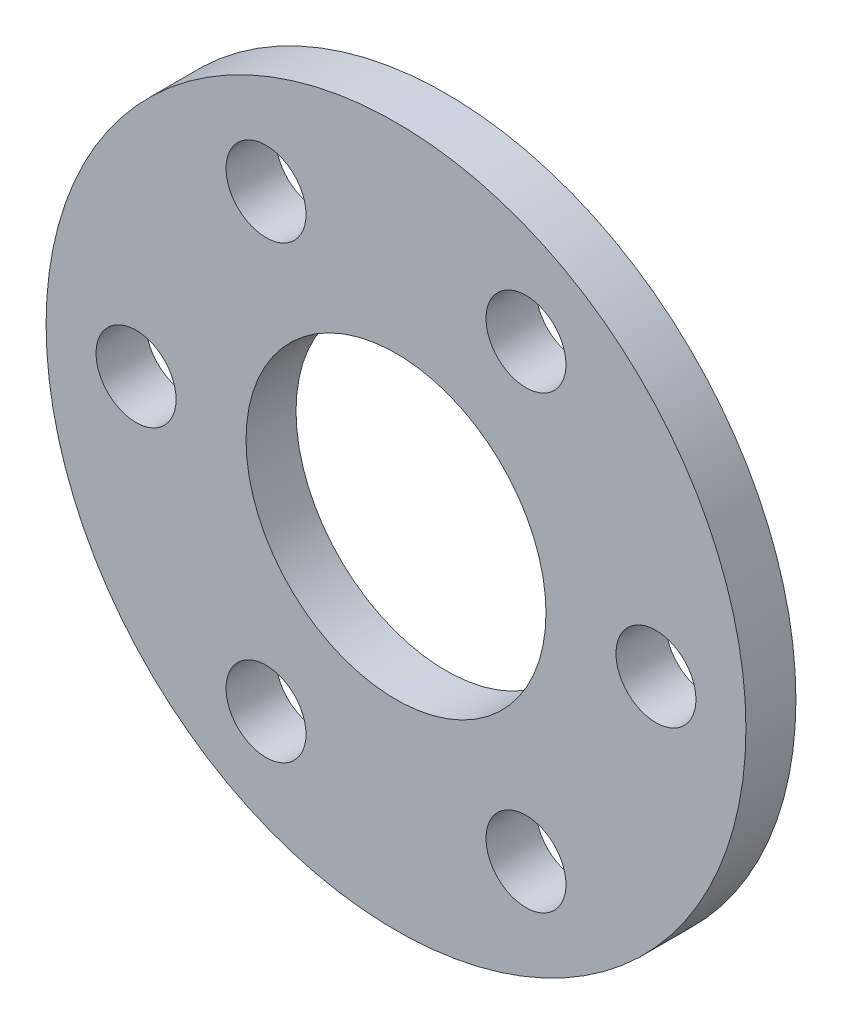
ISO-10303-21;
HEADER;
FILE_DESCRIPTION(('STEP AP214'),'2;1');
FILE_NAME('part.step','',(''),(''),'','','');
FILE_SCHEMA(('AUTOMOTIVE_DESIGN { 1 0 10303 214 1 1 1 1 }'));
ENDSEC;
DATA;
#1=APPLICATION_CONTEXT('core data for automotive mechanical design processes');
#2=APPLICATION_PROTOCOL_DEFINITION('international standard','automotive_design',2000,#1);
#3=PRODUCT_CONTEXT('',#1,'mechanical');
#4=PRODUCT('Part','Part','',(#3));
#5=PRODUCT_RELATED_PRODUCT_CATEGORY('part','',(#4));
#6=PRODUCT_DEFINITION_FORMATION('','',#4);
#7=PRODUCT_DEFINITION_CONTEXT('part definition',#1,'design');
#8=PRODUCT_DEFINITION('design','',#6,#7);
#9=PRODUCT_DEFINITION_SHAPE('','',#8);
#10=(LENGTH_UNIT() NAMED_UNIT(*) SI_UNIT(.MILLI.,.METRE.));
#11=(NAMED_UNIT(*) PLANE_ANGLE_UNIT() SI_UNIT($,.RADIAN.));
#12=(NAMED_UNIT(*) SI_UNIT($,.STERADIAN.) SOLID_ANGLE_UNIT());
#13=UNCERTAINTY_MEASURE_WITH_UNIT(LENGTH_MEASURE(1.E-05),#10,'distance_accuracy_value','');
#14=(GEOMETRIC_REPRESENTATION_CONTEXT(3) GLOBAL_UNCERTAINTY_ASSIGNED_CONTEXT((#13)) GLOBAL_UNIT_ASSIGNED_CONTEXT((#10,
#11,#12)) REPRESENTATION_CONTEXT('',''));
#15=CARTESIAN_POINT('',(0.,0.,0.));
#16=DIRECTION('',(0.,0.,1.));
#17=DIRECTION('',(1.,0.,0.));
#18=AXIS2_PLACEMENT_3D('',#15,#16,#17);
#19=CARTESIAN_POINT('',(0.,0.,10.));
#20=DIRECTION('',(0.,0.,-1.));
#21=DIRECTION('',(-1.,0.,0.));
#22=AXIS2_PLACEMENT_3D('',#19,#20,#21);
#23=CYLINDRICAL_SURFACE('',#22,7.5);
#24=CARTESIAN_POINT('',(0.,0.,0.));
#25=DIRECTION('',(0.,0.,1.));
#26=DIRECTION('',(1.,0.,0.));
#27=AXIS2_PLACEMENT_3D('',#24,#25,#26);
#28=CIRCLE('',#27,7.5);
#29=CARTESIAN_POINT('',(7.5,0.,0.));
#30=VERTEX_POINT('',#29);
#31=EDGE_CURVE('E38',#30,#30,#28,.T.);
#32=ORIENTED_EDGE('',*,*,#31,.F.);
#33=EDGE_LOOP('',(#32));
#34=FACE_BOUND('',#33,.T.);
#35=CARTESIAN_POINT('',(0.,0.,2.5));
#36=DIRECTION('',(0.,0.,1.));
#37=DIRECTION('',(1.,0.,0.));
#38=AXIS2_PLACEMENT_3D('',#35,#36,#37);
#39=CIRCLE('',#38,7.5);
#40=CARTESIAN_POINT('',(7.5,0.,2.5));
#41=VERTEX_POINT('',#40);
#42=EDGE_CURVE('E66',#41,#41,#39,.T.);
#43=ORIENTED_EDGE('',*,*,#42,.T.);
#44=EDGE_LOOP('',(#43));
#45=FACE_BOUND('',#44,.T.);
#46=ADVANCED_FACE('F31',(#34,#45),#23,.F.);
#47=CARTESIAN_POINT('',(-13.,0.,10.));
#48=DIRECTION('',(0.,0.,-1.));
#49=DIRECTION('',(-1.,0.,0.));
#50=AXIS2_PLACEMENT_3D('',#47,#48,#49);
#51=CYLINDRICAL_SURFACE('',#50,2.);
#52=CARTESIAN_POINT('',(-13.,0.,0.));
#53=DIRECTION('',(0.,0.,1.));
#54=DIRECTION('',(1.,0.,0.));
#55=AXIS2_PLACEMENT_3D('',#52,#53,#54);
#56=CIRCLE('',#55,2.);
#57=CARTESIAN_POINT('',(-11.,0.,0.));
#58=VERTEX_POINT('',#57);
#59=EDGE_CURVE('E58',#58,#58,#56,.T.);
#60=ORIENTED_EDGE('',*,*,#59,.F.);
#61=EDGE_LOOP('',(#60));
#62=FACE_BOUND('',#61,.T.);
#63=CARTESIAN_POINT('',(-13.,0.,2.5));
#64=DIRECTION('',(0.,0.,1.));
#65=DIRECTION('',(1.,0.,0.));
#66=AXIS2_PLACEMENT_3D('',#63,#64,#65);
#67=CIRCLE('',#66,2.);
#68=CARTESIAN_POINT('',(-11.,0.,2.5));
#69=VERTEX_POINT('',#68);
#70=EDGE_CURVE('E69',#69,#69,#67,.T.);
#71=ORIENTED_EDGE('',*,*,#70,.T.);
#72=EDGE_LOOP('',(#71));
#73=FACE_BOUND('',#72,.T.);
#74=ADVANCED_FACE('F102',(#62,#73),#51,.F.);
#75=CARTESIAN_POINT('',(-6.49999999999997,-11.2583302491977,10.));
#76=DIRECTION('',(0.,0.,-1.));
#77=DIRECTION('',(-1.,0.,0.));
#78=AXIS2_PLACEMENT_3D('',#75,#76,#77);
#79=CYLINDRICAL_SURFACE('',#78,2.);
#80=CARTESIAN_POINT('',(-6.49999999999997,-11.2583302491977,0.));
#81=DIRECTION('',(0.,0.,1.));
#82=DIRECTION('',(1.,0.,0.));
#83=AXIS2_PLACEMENT_3D('',#80,#81,#82);
#84=CIRCLE('',#83,2.);
#85=CARTESIAN_POINT('',(-4.49999999999997,-11.2583302491977,0.));
#86=VERTEX_POINT('',#85);
#87=EDGE_CURVE('E53',#86,#86,#84,.T.);
#88=ORIENTED_EDGE('',*,*,#87,.F.);
#89=EDGE_LOOP('',(#88));
#90=FACE_BOUND('',#89,.T.);
#91=CARTESIAN_POINT('',(-6.49999999999997,-11.2583302491977,2.5));
#92=DIRECTION('',(0.,0.,1.));
#93=DIRECTION('',(1.,0.,0.));
#94=AXIS2_PLACEMENT_3D('',#91,#92,#93);
#95=CIRCLE('',#94,2.);
#96=CARTESIAN_POINT('',(-4.49999999999997,-11.2583302491977,2.5));
#97=VERTEX_POINT('',#96);
#98=EDGE_CURVE('E72',#97,#97,#95,.T.);
#99=ORIENTED_EDGE('',*,*,#98,.T.);
#100=EDGE_LOOP('',(#99));
#101=FACE_BOUND('',#100,.T.);
#102=ADVANCED_FACE('F107',(#90,#101),#79,.F.);
#103=CARTESIAN_POINT('',(6.49999999999998,-11.2583302491977,10.));
#104=DIRECTION('',(0.,0.,-1.));
#105=DIRECTION('',(-1.,0.,0.));
#106=AXIS2_PLACEMENT_3D('',#103,#104,#105);
#107=CYLINDRICAL_SURFACE('',#106,2.);
#108=CARTESIAN_POINT('',(6.49999999999998,-11.2583302491977,0.));
#109=DIRECTION('',(0.,0.,1.));
#110=DIRECTION('',(1.,0.,0.));
#111=AXIS2_PLACEMENT_3D('',#108,#109,#110);
#112=CIRCLE('',#111,2.);
#113=CARTESIAN_POINT('',(8.49999999999998,-11.2583302491977,0.));
#114=VERTEX_POINT('',#113);
#115=EDGE_CURVE('E49',#114,#114,#112,.T.);
#116=ORIENTED_EDGE('',*,*,#115,.F.);
#117=EDGE_LOOP('',(#116));
#118=FACE_BOUND('',#117,.T.);
#119=CARTESIAN_POINT('',(6.49999999999998,-11.2583302491977,2.5));
#120=DIRECTION('',(0.,0.,1.));
#121=DIRECTION('',(1.,0.,0.));
#122=AXIS2_PLACEMENT_3D('',#119,#120,#121);
#123=CIRCLE('',#122,2.);
#124=CARTESIAN_POINT('',(8.49999999999998,-11.2583302491977,2.5));
#125=VERTEX_POINT('',#124);
#126=EDGE_CURVE('E75',#125,#125,#123,.T.);
#127=ORIENTED_EDGE('',*,*,#126,.T.);
#128=EDGE_LOOP('',(#127));
#129=FACE_BOUND('',#128,.T.);
#130=ADVANCED_FACE('F112',(#118,#129),#107,.F.);
#131=CARTESIAN_POINT('',(13.,0.,10.));
#132=DIRECTION('',(0.,0.,-1.));
#133=DIRECTION('',(-1.,0.,0.));
#134=AXIS2_PLACEMENT_3D('',#131,#132,#133);
#135=CYLINDRICAL_SURFACE('',#134,2.);
#136=CARTESIAN_POINT('',(13.,0.,0.));
#137=DIRECTION('',(0.,0.,1.));
#138=DIRECTION('',(1.,0.,0.));
#139=AXIS2_PLACEMENT_3D('',#136,#137,#138);
#140=CIRCLE('',#139,2.);
#141=CARTESIAN_POINT('',(15.,0.,0.));
#142=VERTEX_POINT('',#141);
#143=EDGE_CURVE('E52',#142,#142,#140,.T.);
#144=ORIENTED_EDGE('',*,*,#143,.F.);
#145=EDGE_LOOP('',(#144));
#146=FACE_BOUND('',#145,.T.);
#147=CARTESIAN_POINT('',(13.,0.,2.5));
#148=DIRECTION('',(0.,0.,1.));
#149=DIRECTION('',(1.,0.,0.));
#150=AXIS2_PLACEMENT_3D('',#147,#148,#149);
#151=CIRCLE('',#150,2.);
#152=CARTESIAN_POINT('',(15.,0.,2.5));
#153=VERTEX_POINT('',#152);
#154=EDGE_CURVE('E78',#153,#153,#151,.T.);
#155=ORIENTED_EDGE('',*,*,#154,.T.);
#156=EDGE_LOOP('',(#155));
#157=FACE_BOUND('',#156,.T.);
#158=ADVANCED_FACE('F115',(#146,#157),#135,.F.);
#159=CARTESIAN_POINT('',(6.49999999999996,11.2583302491977,10.));
#160=DIRECTION('',(0.,0.,-1.));
#161=DIRECTION('',(-1.,0.,0.));
#162=AXIS2_PLACEMENT_3D('',#159,#160,#161);
#163=CYLINDRICAL_SURFACE('',#162,2.);
#164=CARTESIAN_POINT('',(6.49999999999996,11.2583302491977,0.));
#165=DIRECTION('',(0.,0.,1.));
#166=DIRECTION('',(1.,0.,0.));
#167=AXIS2_PLACEMENT_3D('',#164,#165,#166);
#168=CIRCLE('',#167,2.);
#169=CARTESIAN_POINT('',(8.49999999999996,11.2583302491977,0.));
#170=VERTEX_POINT('',#169);
#171=EDGE_CURVE('E46',#170,#170,#168,.T.);
#172=ORIENTED_EDGE('',*,*,#171,.F.);
#173=EDGE_LOOP('',(#172));
#174=FACE_BOUND('',#173,.T.);
#175=CARTESIAN_POINT('',(6.49999999999996,11.2583302491977,2.5));
#176=DIRECTION('',(0.,0.,1.));
#177=DIRECTION('',(1.,0.,0.));
#178=AXIS2_PLACEMENT_3D('',#175,#176,#177);
#179=CIRCLE('',#178,2.);
#180=CARTESIAN_POINT('',(8.49999999999996,11.2583302491977,2.5));
#181=VERTEX_POINT('',#180);
#182=EDGE_CURVE('E81',#181,#181,#179,.T.);
#183=ORIENTED_EDGE('',*,*,#182,.T.);
#184=EDGE_LOOP('',(#183));
#185=FACE_BOUND('',#184,.T.);
#186=ADVANCED_FACE('F119',(#174,#185),#163,.F.);
#187=CARTESIAN_POINT('',(-6.49999999999997,11.2583302491977,10.));
#188=DIRECTION('',(0.,0.,-1.));
#189=DIRECTION('',(-1.,0.,0.));
#190=AXIS2_PLACEMENT_3D('',#187,#188,#189);
#191=CYLINDRICAL_SURFACE('',#190,2.);
#192=CARTESIAN_POINT('',(-6.49999999999997,11.2583302491977,0.));
#193=DIRECTION('',(0.,0.,1.));
#194=DIRECTION('',(1.,0.,0.));
#195=AXIS2_PLACEMENT_3D('',#192,#193,#194);
#196=CIRCLE('',#195,2.);
#197=CARTESIAN_POINT('',(-4.49999999999997,11.2583302491977,0.));
#198=VERTEX_POINT('',#197);
#199=EDGE_CURVE('E42',#198,#198,#196,.T.);
#200=ORIENTED_EDGE('',*,*,#199,.F.);
#201=EDGE_LOOP('',(#200));
#202=FACE_BOUND('',#201,.T.);
#203=CARTESIAN_POINT('',(-6.49999999999997,11.2583302491977,2.5));
#204=DIRECTION('',(0.,0.,1.));
#205=DIRECTION('',(1.,0.,0.));
#206=AXIS2_PLACEMENT_3D('',#203,#204,#205);
#207=CIRCLE('',#206,2.);
#208=CARTESIAN_POINT('',(-4.49999999999997,11.2583302491977,2.5));
#209=VERTEX_POINT('',#208);
#210=EDGE_CURVE('E84',#209,#209,#207,.T.);
#211=ORIENTED_EDGE('',*,*,#210,.T.);
#212=EDGE_LOOP('',(#211));
#213=FACE_BOUND('',#212,.T.);
#214=ADVANCED_FACE('F88',(#202,#213),#191,.F.);
#215=CARTESIAN_POINT('',(0.,0.,10.));
#216=DIRECTION('',(0.,0.,-1.));
#217=DIRECTION('',(-1.,0.,0.));
#218=AXIS2_PLACEMENT_3D('',#215,#216,#217);
#219=CYLINDRICAL_SURFACE('',#218,17.5);
#220=CARTESIAN_POINT('',(0.,0.,0.));
#221=DIRECTION('',(0.,0.,1.));
#222=DIRECTION('',(1.,0.,0.));
#223=AXIS2_PLACEMENT_3D('',#220,#221,#222);
#224=CIRCLE('',#223,17.5);
#225=CARTESIAN_POINT('',(17.5,0.,0.));
#226=VERTEX_POINT('',#225);
#227=EDGE_CURVE('E61',#226,#226,#224,.T.);
#228=ORIENTED_EDGE('',*,*,#227,.T.);
#229=EDGE_LOOP('',(#228));
#230=FACE_BOUND('',#229,.T.);
#231=CARTESIAN_POINT('',(0.,0.,2.5));
#232=DIRECTION('',(0.,0.,1.));
#233=DIRECTION('',(1.,0.,0.));
#234=AXIS2_PLACEMENT_3D('',#231,#232,#233);
#235=CIRCLE('',#234,17.5);
#236=CARTESIAN_POINT('',(17.5,0.,2.5));
#237=VERTEX_POINT('',#236);
#238=EDGE_CURVE('E10',#237,#237,#235,.T.);
#239=ORIENTED_EDGE('',*,*,#238,.F.);
#240=EDGE_LOOP('',(#239));
#241=FACE_BOUND('',#240,.T.);
#242=ADVANCED_FACE('F97',(#230,#241),#219,.T.);
#243=CARTESIAN_POINT('',(0.,0.,0.));
#244=DIRECTION('',(0.,0.,1.));
#245=DIRECTION('',(1.,0.,0.));
#246=AXIS2_PLACEMENT_3D('',#243,#244,#245);
#247=PLANE('',#246);
#248=ORIENTED_EDGE('',*,*,#31,.T.);
#249=EDGE_LOOP('',(#248));
#250=FACE_BOUND('',#249,.T.);
#251=ORIENTED_EDGE('',*,*,#59,.T.);
#252=EDGE_LOOP('',(#251));
#253=FACE_BOUND('',#252,.T.);
#254=ORIENTED_EDGE('',*,*,#87,.T.);
#255=EDGE_LOOP('',(#254));
#256=FACE_BOUND('',#255,.T.);
#257=ORIENTED_EDGE('',*,*,#115,.T.);
#258=EDGE_LOOP('',(#257));
#259=FACE_BOUND('',#258,.T.);
#260=ORIENTED_EDGE('',*,*,#143,.T.);
#261=EDGE_LOOP('',(#260));
#262=FACE_BOUND('',#261,.T.);
#263=ORIENTED_EDGE('',*,*,#171,.T.);
#264=EDGE_LOOP('',(#263));
#265=FACE_BOUND('',#264,.T.);
#266=ORIENTED_EDGE('',*,*,#199,.T.);
#267=EDGE_LOOP('',(#266));
#268=FACE_BOUND('',#267,.T.);
#269=ORIENTED_EDGE('',*,*,#227,.F.);
#270=EDGE_LOOP('',(#269));
#271=FACE_BOUND('',#270,.T.);
#272=ADVANCED_FACE('F33',(#250,#253,#256,#259,#262,#265,#268,#271),#247,.F.);
#273=CARTESIAN_POINT('',(0.,-17.5,2.5));
#274=DIRECTION('',(0.,0.,1.));
#275=DIRECTION('',(1.,0.,0.));
#276=AXIS2_PLACEMENT_3D('',#273,#274,#275);
#277=PLANE('',#276);
#278=ORIENTED_EDGE('',*,*,#42,.F.);
#279=EDGE_LOOP('',(#278));
#280=FACE_BOUND('',#279,.T.);
#281=ORIENTED_EDGE('',*,*,#70,.F.);
#282=EDGE_LOOP('',(#281));
#283=FACE_BOUND('',#282,.T.);
#284=ORIENTED_EDGE('',*,*,#98,.F.);
#285=EDGE_LOOP('',(#284));
#286=FACE_BOUND('',#285,.T.);
#287=ORIENTED_EDGE('',*,*,#126,.F.);
#288=EDGE_LOOP('',(#287));
#289=FACE_BOUND('',#288,.T.);
#290=ORIENTED_EDGE('',*,*,#154,.F.);
#291=EDGE_LOOP('',(#290));
#292=FACE_BOUND('',#291,.T.);
#293=ORIENTED_EDGE('',*,*,#182,.F.);
#294=EDGE_LOOP('',(#293));
#295=FACE_BOUND('',#294,.T.);
#296=ORIENTED_EDGE('',*,*,#210,.F.);
#297=EDGE_LOOP('',(#296));
#298=FACE_BOUND('',#297,.T.);
#299=ORIENTED_EDGE('',*,*,#238,.T.);
#300=EDGE_LOOP('',(#299));
#301=FACE_BOUND('',#300,.T.);
#302=ADVANCED_FACE('F90',(#280,#283,#286,#289,#292,#295,#298,#301),#277,.T.);
#303=CLOSED_SHELL('',(#46,#74,#102,#130,#158,#186,#214,#242,#272,#302));
#304=MANIFOLD_SOLID_BREP('B2',#303);
#305=ADVANCED_BREP_SHAPE_REPRESENTATION('',(#18,#304),#14);
#306=SHAPE_DEFINITION_REPRESENTATION(#9,#305);
ENDSEC;
END-ISO-10303-21;
